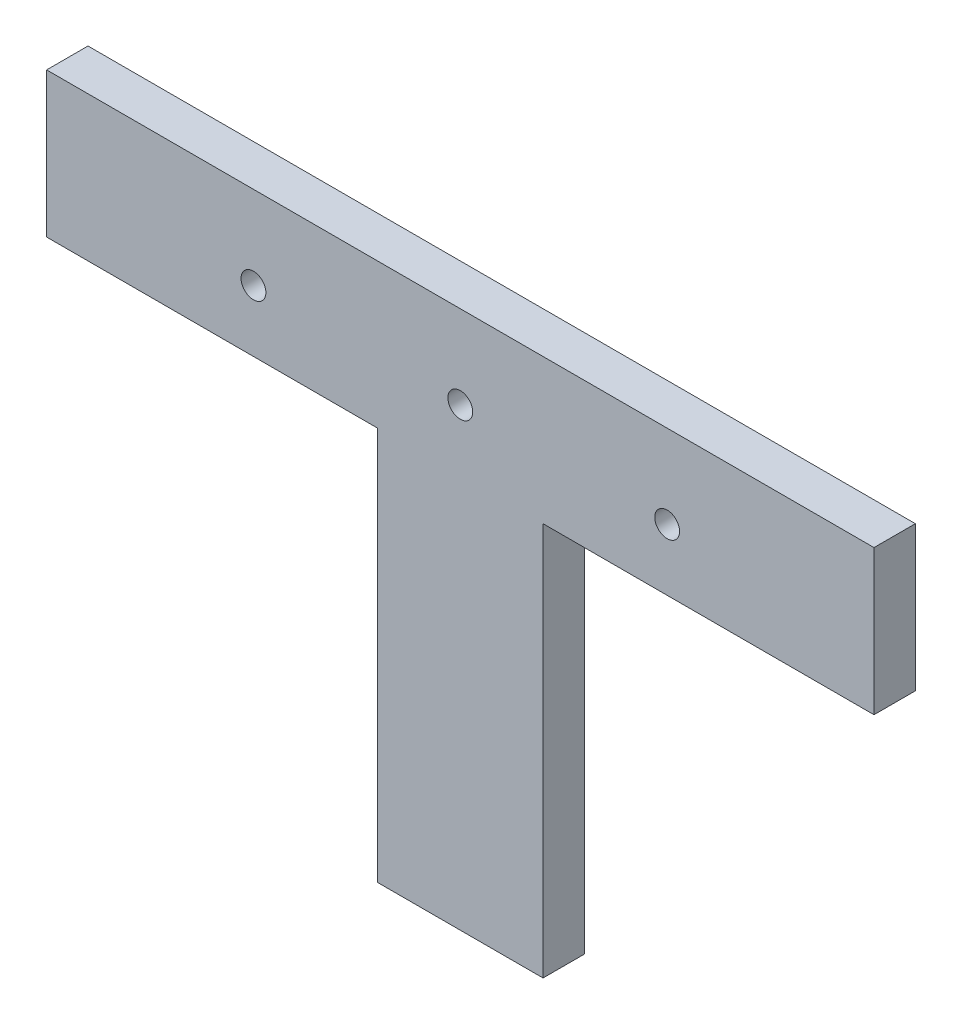
ISO-10303-21;
HEADER;
FILE_DESCRIPTION(('STEP AP214'),'2;1');
FILE_NAME('part.step','',(''),(''),'','','');
FILE_SCHEMA(('AUTOMOTIVE_DESIGN { 1 0 10303 214 1 1 1 1 }'));
ENDSEC;
DATA;
#1=APPLICATION_CONTEXT('core data for automotive mechanical design processes');
#2=APPLICATION_PROTOCOL_DEFINITION('international standard','automotive_design',2000,#1);
#3=PRODUCT_CONTEXT('',#1,'mechanical');
#4=PRODUCT('Part','Part','',(#3));
#5=PRODUCT_RELATED_PRODUCT_CATEGORY('part','',(#4));
#6=PRODUCT_DEFINITION_FORMATION('','',#4);
#7=PRODUCT_DEFINITION_CONTEXT('part definition',#1,'design');
#8=PRODUCT_DEFINITION('design','',#6,#7);
#9=PRODUCT_DEFINITION_SHAPE('','',#8);
#10=(LENGTH_UNIT() NAMED_UNIT(*) SI_UNIT(.MILLI.,.METRE.));
#11=(NAMED_UNIT(*) PLANE_ANGLE_UNIT() SI_UNIT($,.RADIAN.));
#12=(NAMED_UNIT(*) SI_UNIT($,.STERADIAN.) SOLID_ANGLE_UNIT());
#13=UNCERTAINTY_MEASURE_WITH_UNIT(LENGTH_MEASURE(1.E-05),#10,'distance_accuracy_value','');
#14=(GEOMETRIC_REPRESENTATION_CONTEXT(3) GLOBAL_UNCERTAINTY_ASSIGNED_CONTEXT((#13)) GLOBAL_UNIT_ASSIGNED_CONTEXT((#10,
#11,#12)) REPRESENTATION_CONTEXT('',''));
#15=CARTESIAN_POINT('',(0.,0.,0.));
#16=DIRECTION('',(0.,0.,1.));
#17=DIRECTION('',(1.,0.,0.));
#18=AXIS2_PLACEMENT_3D('',#15,#16,#17);
#19=CARTESIAN_POINT('',(-40.1551410613988,102.329702578108,10.));
#20=DIRECTION('',(-1.,0.,0.));
#21=DIRECTION('',(0.,-1.,0.));
#22=AXIS2_PLACEMENT_3D('',#19,#20,#21);
#23=PLANE('',#22);
#24=DIRECTION('',(0.,1.,0.));
#25=VECTOR('',#24,1.);
#26=CARTESIAN_POINT('',(-40.1551410613988,102.329702578108,0.));
#27=LINE('',#26,#25);
#28=CARTESIAN_POINT('',(-40.1551410613988,7.21961406259204,0.));
#29=VERTEX_POINT('',#28);
#30=CARTESIAN_POINT('',(-40.1551410613988,102.329702578108,0.));
#31=VERTEX_POINT('',#30);
#32=EDGE_CURVE('E129',#29,#31,#27,.T.);
#33=ORIENTED_EDGE('',*,*,#32,.T.);
#34=DIRECTION('',(0.,0.,-1.));
#35=VECTOR('',#34,1.);
#36=CARTESIAN_POINT('',(-40.1551410613988,102.329702578108,10.));
#37=LINE('',#36,#35);
#38=CARTESIAN_POINT('',(-40.1551410613988,102.329702578108,10.));
#39=VERTEX_POINT('',#38);
#40=EDGE_CURVE('E11',#39,#31,#37,.T.);
#41=ORIENTED_EDGE('',*,*,#40,.F.);
#42=DIRECTION('',(0.,1.,0.));
#43=VECTOR('',#42,1.);
#44=CARTESIAN_POINT('',(-40.1551410613988,102.329702578108,10.));
#45=LINE('',#44,#43);
#46=CARTESIAN_POINT('',(-40.1551410613988,7.21961406259204,10.));
#47=VERTEX_POINT('',#46);
#48=EDGE_CURVE('E144',#47,#39,#45,.T.);
#49=ORIENTED_EDGE('',*,*,#48,.F.);
#50=DIRECTION('',(0.,0.,-1.));
#51=VECTOR('',#50,1.);
#52=CARTESIAN_POINT('',(-40.1551410613988,7.21961406259204,10.));
#53=LINE('',#52,#51);
#54=EDGE_CURVE('E125',#47,#29,#53,.T.);
#55=ORIENTED_EDGE('',*,*,#54,.T.);
#56=EDGE_LOOP('',(#33,#41,#49,#55));
#57=FACE_BOUND('',#56,.T.);
#58=ADVANCED_FACE('F33',(#57),#23,.F.);
#59=CARTESIAN_POINT('',(39.8448589386012,102.329702578108,10.));
#60=DIRECTION('',(0.,1.,0.));
#61=DIRECTION('',(-1.,0.,0.));
#62=AXIS2_PLACEMENT_3D('',#59,#60,#61);
#63=PLANE('',#62);
#64=DIRECTION('',(1.,0.,0.));
#65=VECTOR('',#64,1.);
#66=CARTESIAN_POINT('',(39.8448589386012,102.329702578108,0.));
#67=LINE('',#66,#65);
#68=CARTESIAN_POINT('',(39.8448589386012,102.329702578108,0.));
#69=VERTEX_POINT('',#68);
#70=EDGE_CURVE('E132',#31,#69,#67,.T.);
#71=ORIENTED_EDGE('',*,*,#70,.T.);
#72=DIRECTION('',(0.,0.,-1.));
#73=VECTOR('',#72,1.);
#74=CARTESIAN_POINT('',(39.8448589386012,102.329702578108,10.));
#75=LINE('',#74,#73);
#76=CARTESIAN_POINT('',(39.8448589386012,102.329702578108,10.));
#77=VERTEX_POINT('',#76);
#78=EDGE_CURVE('E41',#77,#69,#75,.T.);
#79=ORIENTED_EDGE('',*,*,#78,.F.);
#80=DIRECTION('',(1.,0.,0.));
#81=VECTOR('',#80,1.);
#82=CARTESIAN_POINT('',(39.8448589386012,102.329702578108,10.));
#83=LINE('',#82,#81);
#84=EDGE_CURVE('E92',#39,#77,#83,.T.);
#85=ORIENTED_EDGE('',*,*,#84,.F.);
#86=ORIENTED_EDGE('',*,*,#40,.T.);
#87=EDGE_LOOP('',(#71,#79,#85,#86));
#88=FACE_BOUND('',#87,.T.);
#89=ADVANCED_FACE('F221',(#88),#63,.F.);
#90=CARTESIAN_POINT('',(39.8448589386012,137.329702578108,10.));
#91=DIRECTION('',(-1.,0.,0.));
#92=DIRECTION('',(0.,-1.,0.));
#93=AXIS2_PLACEMENT_3D('',#90,#91,#92);
#94=PLANE('',#93);
#95=DIRECTION('',(0.,1.,0.));
#96=VECTOR('',#95,1.);
#97=CARTESIAN_POINT('',(39.8448589386012,137.329702578108,0.));
#98=LINE('',#97,#96);
#99=CARTESIAN_POINT('',(39.8448589386012,137.329702578108,0.));
#100=VERTEX_POINT('',#99);
#101=EDGE_CURVE('E135',#69,#100,#98,.T.);
#102=ORIENTED_EDGE('',*,*,#101,.T.);
#103=DIRECTION('',(0.,0.,-1.));
#104=VECTOR('',#103,1.);
#105=CARTESIAN_POINT('',(39.8448589386012,137.329702578108,10.));
#106=LINE('',#105,#104);
#107=CARTESIAN_POINT('',(39.8448589386012,137.329702578108,10.));
#108=VERTEX_POINT('',#107);
#109=EDGE_CURVE('E151',#108,#100,#106,.T.);
#110=ORIENTED_EDGE('',*,*,#109,.F.);
#111=DIRECTION('',(0.,1.,0.));
#112=VECTOR('',#111,1.);
#113=CARTESIAN_POINT('',(39.8448589386012,137.329702578108,10.));
#114=LINE('',#113,#112);
#115=EDGE_CURVE('E159',#77,#108,#114,.T.);
#116=ORIENTED_EDGE('',*,*,#115,.F.);
#117=ORIENTED_EDGE('',*,*,#78,.T.);
#118=EDGE_LOOP('',(#102,#110,#116,#117));
#119=FACE_BOUND('',#118,.T.);
#120=ADVANCED_FACE('F157',(#119),#94,.F.);
#121=CARTESIAN_POINT('',(-160.155141061399,137.329702578108,10.));
#122=DIRECTION('',(0.,-1.,0.));
#123=DIRECTION('',(0.,0.,-1.));
#124=AXIS2_PLACEMENT_3D('',#121,#122,#123);
#125=PLANE('',#124);
#126=DIRECTION('',(-1.,0.,0.));
#127=VECTOR('',#126,1.);
#128=CARTESIAN_POINT('',(-160.155141061399,137.329702578108,0.));
#129=LINE('',#128,#127);
#130=CARTESIAN_POINT('',(-160.155141061399,137.329702578108,0.));
#131=VERTEX_POINT('',#130);
#132=EDGE_CURVE('E137',#100,#131,#129,.T.);
#133=ORIENTED_EDGE('',*,*,#132,.T.);
#134=DIRECTION('',(0.,0.,-1.));
#135=VECTOR('',#134,1.);
#136=CARTESIAN_POINT('',(-160.155141061399,137.329702578108,10.));
#137=LINE('',#136,#135);
#138=CARTESIAN_POINT('',(-160.155141061399,137.329702578108,10.));
#139=VERTEX_POINT('',#138);
#140=EDGE_CURVE('E148',#139,#131,#137,.T.);
#141=ORIENTED_EDGE('',*,*,#140,.F.);
#142=DIRECTION('',(-1.,0.,0.));
#143=VECTOR('',#142,1.);
#144=CARTESIAN_POINT('',(-160.155141061399,137.329702578108,10.));
#145=LINE('',#144,#143);
#146=EDGE_CURVE('E171',#108,#139,#145,.T.);
#147=ORIENTED_EDGE('',*,*,#146,.F.);
#148=ORIENTED_EDGE('',*,*,#109,.T.);
#149=EDGE_LOOP('',(#133,#141,#147,#148));
#150=FACE_BOUND('',#149,.T.);
#151=ADVANCED_FACE('F167',(#150),#125,.F.);
#152=CARTESIAN_POINT('',(-160.155141061399,102.329702578108,10.));
#153=DIRECTION('',(1.,0.,0.));
#154=DIRECTION('',(0.,1.,0.));
#155=AXIS2_PLACEMENT_3D('',#152,#153,#154);
#156=PLANE('',#155);
#157=DIRECTION('',(0.,-1.,0.));
#158=VECTOR('',#157,1.);
#159=CARTESIAN_POINT('',(-160.155141061399,102.329702578108,0.));
#160=LINE('',#159,#158);
#161=CARTESIAN_POINT('',(-160.155141061399,102.329702578108,0.));
#162=VERTEX_POINT('',#161);
#163=EDGE_CURVE('E139',#131,#162,#160,.T.);
#164=ORIENTED_EDGE('',*,*,#163,.T.);
#165=DIRECTION('',(0.,0.,-1.));
#166=VECTOR('',#165,1.);
#167=CARTESIAN_POINT('',(-160.155141061399,102.329702578108,10.));
#168=LINE('',#167,#166);
#169=CARTESIAN_POINT('',(-160.155141061399,102.329702578108,10.));
#170=VERTEX_POINT('',#169);
#171=EDGE_CURVE('E120',#170,#162,#168,.T.);
#172=ORIENTED_EDGE('',*,*,#171,.F.);
#173=DIRECTION('',(0.,-1.,0.));
#174=VECTOR('',#173,1.);
#175=CARTESIAN_POINT('',(-160.155141061399,102.329702578108,10.));
#176=LINE('',#175,#174);
#177=EDGE_CURVE('E111',#139,#170,#176,.T.);
#178=ORIENTED_EDGE('',*,*,#177,.F.);
#179=ORIENTED_EDGE('',*,*,#140,.T.);
#180=EDGE_LOOP('',(#164,#172,#178,#179));
#181=FACE_BOUND('',#180,.T.);
#182=ADVANCED_FACE('F170',(#181),#156,.F.);
#183=CARTESIAN_POINT('',(-80.1551410613988,102.329702578108,10.));
#184=DIRECTION('',(0.,1.,0.));
#185=DIRECTION('',(-1.,0.,0.));
#186=AXIS2_PLACEMENT_3D('',#183,#184,#185);
#187=PLANE('',#186);
#188=DIRECTION('',(1.,0.,0.));
#189=VECTOR('',#188,1.);
#190=CARTESIAN_POINT('',(-80.1551410613988,102.329702578108,0.));
#191=LINE('',#190,#189);
#192=CARTESIAN_POINT('',(-80.1551410613988,102.329702578108,0.));
#193=VERTEX_POINT('',#192);
#194=EDGE_CURVE('E119',#162,#193,#191,.T.);
#195=ORIENTED_EDGE('',*,*,#194,.T.);
#196=DIRECTION('',(0.,0.,-1.));
#197=VECTOR('',#196,1.);
#198=CARTESIAN_POINT('',(-80.1551410613988,102.329702578108,10.));
#199=LINE('',#198,#197);
#200=CARTESIAN_POINT('',(-80.1551410613988,102.329702578108,10.));
#201=VERTEX_POINT('',#200);
#202=EDGE_CURVE('E116',#201,#193,#199,.T.);
#203=ORIENTED_EDGE('',*,*,#202,.F.);
#204=DIRECTION('',(1.,0.,0.));
#205=VECTOR('',#204,1.);
#206=CARTESIAN_POINT('',(-80.1551410613988,102.329702578108,10.));
#207=LINE('',#206,#205);
#208=EDGE_CURVE('E105',#170,#201,#207,.T.);
#209=ORIENTED_EDGE('',*,*,#208,.F.);
#210=ORIENTED_EDGE('',*,*,#171,.T.);
#211=EDGE_LOOP('',(#195,#203,#209,#210));
#212=FACE_BOUND('',#211,.T.);
#213=ADVANCED_FACE('F117',(#212),#187,.F.);
#214=CARTESIAN_POINT('',(-80.1551410613988,7.21961406259203,10.));
#215=DIRECTION('',(1.,0.,0.));
#216=DIRECTION('',(0.,0.,-1.));
#217=AXIS2_PLACEMENT_3D('',#214,#215,#216);
#218=PLANE('',#217);
#219=DIRECTION('',(0.,-1.,0.));
#220=VECTOR('',#219,1.);
#221=CARTESIAN_POINT('',(-80.1551410613988,7.21961406259203,0.));
#222=LINE('',#221,#220);
#223=CARTESIAN_POINT('',(-80.1551410613988,7.21961406259203,0.));
#224=VERTEX_POINT('',#223);
#225=EDGE_CURVE('E78',#193,#224,#222,.T.);
#226=ORIENTED_EDGE('',*,*,#225,.T.);
#227=DIRECTION('',(0.,0.,-1.));
#228=VECTOR('',#227,1.);
#229=CARTESIAN_POINT('',(-80.1551410613988,7.21961406259203,10.));
#230=LINE('',#229,#228);
#231=CARTESIAN_POINT('',(-80.1551410613988,7.21961406259203,10.));
#232=VERTEX_POINT('',#231);
#233=EDGE_CURVE('E121',#232,#224,#230,.T.);
#234=ORIENTED_EDGE('',*,*,#233,.F.);
#235=DIRECTION('',(0.,-1.,0.));
#236=VECTOR('',#235,1.);
#237=CARTESIAN_POINT('',(-80.1551410613988,7.21961406259203,10.));
#238=LINE('',#237,#236);
#239=EDGE_CURVE('E109',#201,#232,#238,.T.);
#240=ORIENTED_EDGE('',*,*,#239,.F.);
#241=ORIENTED_EDGE('',*,*,#202,.T.);
#242=EDGE_LOOP('',(#226,#234,#240,#241));
#243=FACE_BOUND('',#242,.T.);
#244=ADVANCED_FACE('F123',(#243),#218,.F.);
#245=CARTESIAN_POINT('',(-40.1551410613988,7.21961406259204,10.));
#246=DIRECTION('',(0.,1.,0.));
#247=DIRECTION('',(-1.,0.,0.));
#248=AXIS2_PLACEMENT_3D('',#245,#246,#247);
#249=PLANE('',#248);
#250=DIRECTION('',(1.,0.,0.));
#251=VECTOR('',#250,1.);
#252=CARTESIAN_POINT('',(-40.1551410613988,7.21961406259204,0.));
#253=LINE('',#252,#251);
#254=EDGE_CURVE('E84',#224,#29,#253,.T.);
#255=ORIENTED_EDGE('',*,*,#254,.T.);
#256=ORIENTED_EDGE('',*,*,#54,.F.);
#257=DIRECTION('',(1.,0.,0.));
#258=VECTOR('',#257,1.);
#259=CARTESIAN_POINT('',(-40.1551410613988,7.21961406259204,10.));
#260=LINE('',#259,#258);
#261=EDGE_CURVE('E49',#232,#47,#260,.T.);
#262=ORIENTED_EDGE('',*,*,#261,.F.);
#263=ORIENTED_EDGE('',*,*,#233,.T.);
#264=EDGE_LOOP('',(#255,#256,#262,#263));
#265=FACE_BOUND('',#264,.T.);
#266=ADVANCED_FACE('F200',(#265),#249,.F.);
#267=CARTESIAN_POINT('',(0.,0.,10.));
#268=DIRECTION('',(0.,0.,-1.));
#269=DIRECTION('',(-1.,0.,0.));
#270=AXIS2_PLACEMENT_3D('',#267,#268,#269);
#271=PLANE('',#270);
#272=CARTESIAN_POINT('',(-60.1551410613988,117.189491535266,10.));
#273=DIRECTION('',(0.,0.,1.));
#274=DIRECTION('',(1.,0.,0.));
#275=AXIS2_PLACEMENT_3D('',#272,#273,#274);
#276=CIRCLE('',#275,3.);
#277=CARTESIAN_POINT('',(-57.1551410613988,117.189491535266,10.));
#278=VERTEX_POINT('',#277);
#279=EDGE_CURVE('E186',#278,#278,#276,.T.);
#280=ORIENTED_EDGE('',*,*,#279,.F.);
#281=EDGE_LOOP('',(#280));
#282=FACE_BOUND('',#281,.T.);
#283=CARTESIAN_POINT('',(-110.155141061399,117.189491535266,10.));
#284=DIRECTION('',(0.,0.,1.));
#285=DIRECTION('',(1.,0.,0.));
#286=AXIS2_PLACEMENT_3D('',#283,#284,#285);
#287=CIRCLE('',#286,3.);
#288=CARTESIAN_POINT('',(-107.155141061399,117.189491535266,10.));
#289=VERTEX_POINT('',#288);
#290=EDGE_CURVE('E187',#289,#289,#287,.T.);
#291=ORIENTED_EDGE('',*,*,#290,.F.);
#292=EDGE_LOOP('',(#291));
#293=FACE_BOUND('',#292,.T.);
#294=CARTESIAN_POINT('',(-10.1551410613988,117.189491535266,10.));
#295=DIRECTION('',(0.,0.,1.));
#296=DIRECTION('',(1.,0.,0.));
#297=AXIS2_PLACEMENT_3D('',#294,#295,#296);
#298=CIRCLE('',#297,3.);
#299=CARTESIAN_POINT('',(-7.15514106139883,117.189491535266,10.));
#300=VERTEX_POINT('',#299);
#301=EDGE_CURVE('E179',#300,#300,#298,.T.);
#302=ORIENTED_EDGE('',*,*,#301,.F.);
#303=EDGE_LOOP('',(#302));
#304=FACE_BOUND('',#303,.T.);
#305=ORIENTED_EDGE('',*,*,#48,.T.);
#306=ORIENTED_EDGE('',*,*,#84,.T.);
#307=ORIENTED_EDGE('',*,*,#115,.T.);
#308=ORIENTED_EDGE('',*,*,#146,.T.);
#309=ORIENTED_EDGE('',*,*,#177,.T.);
#310=ORIENTED_EDGE('',*,*,#208,.T.);
#311=ORIENTED_EDGE('',*,*,#239,.T.);
#312=ORIENTED_EDGE('',*,*,#261,.T.);
#313=EDGE_LOOP('',(#305,#306,#307,#308,#309,#310,#311,#312));
#314=FACE_BOUND('',#313,.T.);
#315=ADVANCED_FACE('F107',(#282,#293,#304,#314),#271,.F.);
#316=CARTESIAN_POINT('',(0.,0.,0.));
#317=DIRECTION('',(0.,0.,-1.));
#318=DIRECTION('',(-1.,0.,0.));
#319=AXIS2_PLACEMENT_3D('',#316,#317,#318);
#320=PLANE('',#319);
#321=CARTESIAN_POINT('',(-60.1551410613988,117.189491535266,0.));
#322=DIRECTION('',(0.,0.,-1.));
#323=DIRECTION('',(-1.,0.,0.));
#324=AXIS2_PLACEMENT_3D('',#321,#322,#323);
#325=CIRCLE('',#324,3.);
#326=CARTESIAN_POINT('',(-63.1551410613988,117.189491535266,0.));
#327=VERTEX_POINT('',#326);
#328=EDGE_CURVE('E182',#327,#327,#325,.F.);
#329=ORIENTED_EDGE('',*,*,#328,.T.);
#330=EDGE_LOOP('',(#329));
#331=FACE_BOUND('',#330,.T.);
#332=CARTESIAN_POINT('',(-110.155141061399,117.189491535266,0.));
#333=DIRECTION('',(0.,0.,-1.));
#334=DIRECTION('',(-1.,0.,0.));
#335=AXIS2_PLACEMENT_3D('',#332,#333,#334);
#336=CIRCLE('',#335,3.);
#337=CARTESIAN_POINT('',(-113.155141061399,117.189491535266,0.));
#338=VERTEX_POINT('',#337);
#339=EDGE_CURVE('E183',#338,#338,#336,.F.);
#340=ORIENTED_EDGE('',*,*,#339,.T.);
#341=EDGE_LOOP('',(#340));
#342=FACE_BOUND('',#341,.T.);
#343=CARTESIAN_POINT('',(-10.1551410613988,117.189491535266,0.));
#344=DIRECTION('',(0.,0.,-1.));
#345=DIRECTION('',(-1.,0.,0.));
#346=AXIS2_PLACEMENT_3D('',#343,#344,#345);
#347=CIRCLE('',#346,3.);
#348=CARTESIAN_POINT('',(-13.1551410613988,117.189491535266,0.));
#349=VERTEX_POINT('',#348);
#350=EDGE_CURVE('E133',#349,#349,#347,.F.);
#351=ORIENTED_EDGE('',*,*,#350,.T.);
#352=EDGE_LOOP('',(#351));
#353=FACE_BOUND('',#352,.T.);
#354=ORIENTED_EDGE('',*,*,#32,.F.);
#355=ORIENTED_EDGE('',*,*,#254,.F.);
#356=ORIENTED_EDGE('',*,*,#225,.F.);
#357=ORIENTED_EDGE('',*,*,#194,.F.);
#358=ORIENTED_EDGE('',*,*,#163,.F.);
#359=ORIENTED_EDGE('',*,*,#132,.F.);
#360=ORIENTED_EDGE('',*,*,#101,.F.);
#361=ORIENTED_EDGE('',*,*,#70,.F.);
#362=EDGE_LOOP('',(#354,#355,#356,#357,#358,#359,#360,#361));
#363=FACE_BOUND('',#362,.T.);
#364=ADVANCED_FACE('F163',(#331,#342,#353,#363),#320,.T.);
#365=CARTESIAN_POINT('',(-10.1551410613988,117.189491535266,-8.48528137423858));
#366=DIRECTION('',(0.,0.,1.));
#367=DIRECTION('',(1.,0.,0.));
#368=AXIS2_PLACEMENT_3D('',#365,#366,#367);
#369=CYLINDRICAL_SURFACE('',#368,3.);
#370=ORIENTED_EDGE('',*,*,#301,.T.);
#371=EDGE_LOOP('',(#370));
#372=FACE_BOUND('',#371,.T.);
#373=ORIENTED_EDGE('',*,*,#350,.F.);
#374=EDGE_LOOP('',(#373));
#375=FACE_BOUND('',#374,.T.);
#376=ADVANCED_FACE('F206',(#372,#375),#369,.F.);
#377=CARTESIAN_POINT('',(-110.155141061399,117.189491535266,-8.48528137423858));
#378=DIRECTION('',(0.,0.,1.));
#379=DIRECTION('',(1.,0.,0.));
#380=AXIS2_PLACEMENT_3D('',#377,#378,#379);
#381=CYLINDRICAL_SURFACE('',#380,3.);
#382=ORIENTED_EDGE('',*,*,#290,.T.);
#383=EDGE_LOOP('',(#382));
#384=FACE_BOUND('',#383,.T.);
#385=ORIENTED_EDGE('',*,*,#339,.F.);
#386=EDGE_LOOP('',(#385));
#387=FACE_BOUND('',#386,.T.);
#388=ADVANCED_FACE('F209',(#384,#387),#381,.F.);
#389=CARTESIAN_POINT('',(-60.1551410613988,117.189491535266,-8.48528137423857));
#390=DIRECTION('',(0.,0.,1.));
#391=DIRECTION('',(1.,0.,0.));
#392=AXIS2_PLACEMENT_3D('',#389,#390,#391);
#393=CYLINDRICAL_SURFACE('',#392,3.);
#394=ORIENTED_EDGE('',*,*,#279,.T.);
#395=EDGE_LOOP('',(#394));
#396=FACE_BOUND('',#395,.T.);
#397=ORIENTED_EDGE('',*,*,#328,.F.);
#398=EDGE_LOOP('',(#397));
#399=FACE_BOUND('',#398,.T.);
#400=ADVANCED_FACE('F195',(#396,#399),#393,.F.);
#401=CLOSED_SHELL('',(#58,#89,#120,#151,#182,#213,#244,#266,#315,#364,#376,#388,#400));
#402=MANIFOLD_SOLID_BREP('B2',#401);
#403=ADVANCED_BREP_SHAPE_REPRESENTATION('',(#18,#402),#14);
#404=SHAPE_DEFINITION_REPRESENTATION(#9,#403);
ENDSEC;
END-ISO-10303-21;
